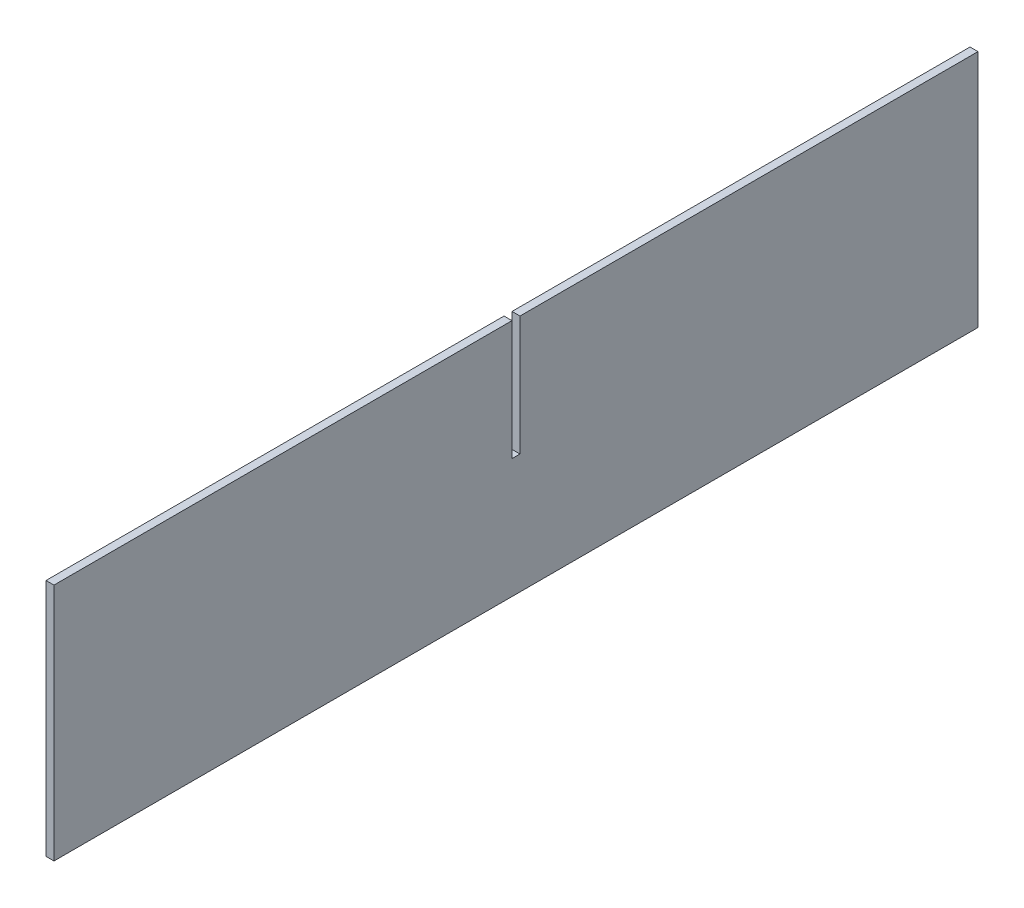
ISO-10303-21;
HEADER;
FILE_DESCRIPTION(('STEP AP214'),'2;1');
FILE_NAME('part.step','',(''),(''),'','','');
FILE_SCHEMA(('AUTOMOTIVE_DESIGN { 1 0 10303 214 1 1 1 1 }'));
ENDSEC;
DATA;
#1=APPLICATION_CONTEXT('core data for automotive mechanical design processes');
#2=APPLICATION_PROTOCOL_DEFINITION('international standard','automotive_design',2000,#1);
#3=PRODUCT_CONTEXT('',#1,'mechanical');
#4=PRODUCT('Part','Part','',(#3));
#5=PRODUCT_RELATED_PRODUCT_CATEGORY('part','',(#4));
#6=PRODUCT_DEFINITION_FORMATION('','',#4);
#7=PRODUCT_DEFINITION_CONTEXT('part definition',#1,'design');
#8=PRODUCT_DEFINITION('design','',#6,#7);
#9=PRODUCT_DEFINITION_SHAPE('','',#8);
#10=(LENGTH_UNIT() NAMED_UNIT(*) SI_UNIT(.MILLI.,.METRE.));
#11=(NAMED_UNIT(*) PLANE_ANGLE_UNIT() SI_UNIT($,.RADIAN.));
#12=(NAMED_UNIT(*) SI_UNIT($,.STERADIAN.) SOLID_ANGLE_UNIT());
#13=UNCERTAINTY_MEASURE_WITH_UNIT(LENGTH_MEASURE(1.E-05),#10,'distance_accuracy_value','');
#14=(GEOMETRIC_REPRESENTATION_CONTEXT(3) GLOBAL_UNCERTAINTY_ASSIGNED_CONTEXT((#13)) GLOBAL_UNIT_ASSIGNED_CONTEXT((#10,
#11,#12)) REPRESENTATION_CONTEXT('',''));
#15=CARTESIAN_POINT('',(0.,0.,0.));
#16=DIRECTION('',(0.,0.,1.));
#17=DIRECTION('',(1.,0.,0.));
#18=AXIS2_PLACEMENT_3D('',#15,#16,#17);
#19=CARTESIAN_POINT('',(1.25,37.5,0.));
#20=DIRECTION('',(0.,1.,0.));
#21=DIRECTION('',(0.,0.,1.));
#22=AXIS2_PLACEMENT_3D('',#19,#20,#21);
#23=PLANE('',#22);
#24=DIRECTION('',(0.,0.,-1.));
#25=VECTOR('',#24,1.);
#26=CARTESIAN_POINT('',(-1.25,37.5,0.));
#27=LINE('',#26,#25);
#28=CARTESIAN_POINT('',(-1.25,37.5,145.));
#29=VERTEX_POINT('',#28);
#30=CARTESIAN_POINT('',(-1.25,37.5,1.25));
#31=VERTEX_POINT('',#30);
#32=EDGE_CURVE('E130',#29,#31,#27,.T.);
#33=ORIENTED_EDGE('',*,*,#32,.F.);
#34=DIRECTION('',(-1.,0.,0.));
#35=VECTOR('',#34,1.);
#36=CARTESIAN_POINT('',(1.25,37.5,145.));
#37=LINE('',#36,#35);
#38=CARTESIAN_POINT('',(1.25,37.5,145.));
#39=VERTEX_POINT('',#38);
#40=EDGE_CURVE('E11',#39,#29,#37,.T.);
#41=ORIENTED_EDGE('',*,*,#40,.F.);
#42=DIRECTION('',(0.,0.,-1.));
#43=VECTOR('',#42,1.);
#44=CARTESIAN_POINT('',(1.25,37.5,0.));
#45=LINE('',#44,#43);
#46=CARTESIAN_POINT('',(1.25,37.5,1.25));
#47=VERTEX_POINT('',#46);
#48=EDGE_CURVE('E149',#39,#47,#45,.T.);
#49=ORIENTED_EDGE('',*,*,#48,.T.);
#50=DIRECTION('',(-1.,0.,0.));
#51=VECTOR('',#50,1.);
#52=CARTESIAN_POINT('',(1.25,37.5,1.25));
#53=LINE('',#52,#51);
#54=EDGE_CURVE('E88',#47,#31,#53,.T.);
#55=ORIENTED_EDGE('',*,*,#54,.T.);
#56=EDGE_LOOP('',(#33,#41,#49,#55));
#57=FACE_BOUND('',#56,.T.);
#58=ADVANCED_FACE('F38',(#57),#23,.T.);
#59=CARTESIAN_POINT('',(1.25,0.,145.));
#60=DIRECTION('',(0.,0.,1.));
#61=DIRECTION('',(1.,0.,0.));
#62=AXIS2_PLACEMENT_3D('',#59,#60,#61);
#63=PLANE('',#62);
#64=DIRECTION('',(0.,1.,0.));
#65=VECTOR('',#64,1.);
#66=CARTESIAN_POINT('',(-1.25,0.,145.));
#67=LINE('',#66,#65);
#68=CARTESIAN_POINT('',(-1.25,-37.5,145.));
#69=VERTEX_POINT('',#68);
#70=EDGE_CURVE('E133',#69,#29,#67,.T.);
#71=ORIENTED_EDGE('',*,*,#70,.F.);
#72=DIRECTION('',(-1.,0.,0.));
#73=VECTOR('',#72,1.);
#74=CARTESIAN_POINT('',(1.25,-37.5,145.));
#75=LINE('',#74,#73);
#76=CARTESIAN_POINT('',(1.25,-37.5,145.));
#77=VERTEX_POINT('',#76);
#78=EDGE_CURVE('E46',#77,#69,#75,.T.);
#79=ORIENTED_EDGE('',*,*,#78,.F.);
#80=DIRECTION('',(0.,1.,0.));
#81=VECTOR('',#80,1.);
#82=CARTESIAN_POINT('',(1.25,0.,145.));
#83=LINE('',#82,#81);
#84=EDGE_CURVE('E171',#77,#39,#83,.T.);
#85=ORIENTED_EDGE('',*,*,#84,.T.);
#86=ORIENTED_EDGE('',*,*,#40,.T.);
#87=EDGE_LOOP('',(#71,#79,#85,#86));
#88=FACE_BOUND('',#87,.T.);
#89=ADVANCED_FACE('F170',(#88),#63,.T.);
#90=CARTESIAN_POINT('',(1.25,-37.5,0.));
#91=DIRECTION('',(0.,1.,0.));
#92=DIRECTION('',(0.,0.,1.));
#93=AXIS2_PLACEMENT_3D('',#90,#91,#92);
#94=PLANE('',#93);
#95=DIRECTION('',(0.,0.,-1.));
#96=VECTOR('',#95,1.);
#97=CARTESIAN_POINT('',(-1.25,-37.5,0.));
#98=LINE('',#97,#96);
#99=CARTESIAN_POINT('',(-1.25,-37.5,-145.));
#100=VERTEX_POINT('',#99);
#101=EDGE_CURVE('E136',#69,#100,#98,.T.);
#102=ORIENTED_EDGE('',*,*,#101,.T.);
#103=DIRECTION('',(-1.,0.,0.));
#104=VECTOR('',#103,1.);
#105=CARTESIAN_POINT('',(1.25,-37.5,-145.));
#106=LINE('',#105,#104);
#107=CARTESIAN_POINT('',(1.25,-37.5,-145.));
#108=VERTEX_POINT('',#107);
#109=EDGE_CURVE('E155',#108,#100,#106,.T.);
#110=ORIENTED_EDGE('',*,*,#109,.F.);
#111=DIRECTION('',(0.,0.,-1.));
#112=VECTOR('',#111,1.);
#113=CARTESIAN_POINT('',(1.25,-37.5,0.));
#114=LINE('',#113,#112);
#115=EDGE_CURVE('E162',#77,#108,#114,.T.);
#116=ORIENTED_EDGE('',*,*,#115,.F.);
#117=ORIENTED_EDGE('',*,*,#78,.T.);
#118=EDGE_LOOP('',(#102,#110,#116,#117));
#119=FACE_BOUND('',#118,.T.);
#120=ADVANCED_FACE('F160',(#119),#94,.F.);
#121=CARTESIAN_POINT('',(1.25,0.,-145.));
#122=DIRECTION('',(0.,0.,1.));
#123=DIRECTION('',(1.,0.,0.));
#124=AXIS2_PLACEMENT_3D('',#121,#122,#123);
#125=PLANE('',#124);
#126=DIRECTION('',(0.,1.,0.));
#127=VECTOR('',#126,1.);
#128=CARTESIAN_POINT('',(-1.25,0.,-145.));
#129=LINE('',#128,#127);
#130=CARTESIAN_POINT('',(-1.25,37.5,-145.));
#131=VERTEX_POINT('',#130);
#132=EDGE_CURVE('E138',#100,#131,#129,.T.);
#133=ORIENTED_EDGE('',*,*,#132,.T.);
#134=DIRECTION('',(-1.,0.,0.));
#135=VECTOR('',#134,1.);
#136=CARTESIAN_POINT('',(1.25,37.5,-145.));
#137=LINE('',#136,#135);
#138=CARTESIAN_POINT('',(1.25,37.5,-145.));
#139=VERTEX_POINT('',#138);
#140=EDGE_CURVE('E153',#139,#131,#137,.T.);
#141=ORIENTED_EDGE('',*,*,#140,.F.);
#142=DIRECTION('',(0.,1.,0.));
#143=VECTOR('',#142,1.);
#144=CARTESIAN_POINT('',(1.25,0.,-145.));
#145=LINE('',#144,#143);
#146=EDGE_CURVE('E177',#108,#139,#145,.T.);
#147=ORIENTED_EDGE('',*,*,#146,.F.);
#148=ORIENTED_EDGE('',*,*,#109,.T.);
#149=EDGE_LOOP('',(#133,#141,#147,#148));
#150=FACE_BOUND('',#149,.T.);
#151=ADVANCED_FACE('F184',(#150),#125,.F.);
#152=CARTESIAN_POINT('',(1.25,37.5,0.));
#153=DIRECTION('',(0.,1.,0.));
#154=DIRECTION('',(0.,0.,1.));
#155=AXIS2_PLACEMENT_3D('',#152,#153,#154);
#156=PLANE('',#155);
#157=DIRECTION('',(0.,0.,-1.));
#158=VECTOR('',#157,1.);
#159=CARTESIAN_POINT('',(-1.25,37.5,0.));
#160=LINE('',#159,#158);
#161=CARTESIAN_POINT('',(-1.25,37.5,-1.24999999999999));
#162=VERTEX_POINT('',#161);
#163=EDGE_CURVE('E141',#162,#131,#160,.T.);
#164=ORIENTED_EDGE('',*,*,#163,.F.);
#165=DIRECTION('',(-1.,0.,0.));
#166=VECTOR('',#165,1.);
#167=CARTESIAN_POINT('',(1.25,37.5,-1.24999999999999));
#168=LINE('',#167,#166);
#169=CARTESIAN_POINT('',(1.25,37.5,-1.24999999999999));
#170=VERTEX_POINT('',#169);
#171=EDGE_CURVE('E117',#170,#162,#168,.T.);
#172=ORIENTED_EDGE('',*,*,#171,.F.);
#173=DIRECTION('',(0.,0.,-1.));
#174=VECTOR('',#173,1.);
#175=CARTESIAN_POINT('',(1.25,37.5,0.));
#176=LINE('',#175,#174);
#177=EDGE_CURVE('E123',#170,#139,#176,.T.);
#178=ORIENTED_EDGE('',*,*,#177,.T.);
#179=ORIENTED_EDGE('',*,*,#140,.T.);
#180=EDGE_LOOP('',(#164,#172,#178,#179));
#181=FACE_BOUND('',#180,.T.);
#182=ADVANCED_FACE('F180',(#181),#156,.T.);
#183=CARTESIAN_POINT('',(1.25,0.,-1.25));
#184=DIRECTION('',(0.,0.,1.));
#185=DIRECTION('',(0.,-1.,0.));
#186=AXIS2_PLACEMENT_3D('',#183,#184,#185);
#187=PLANE('',#186);
#188=DIRECTION('',(0.,1.,0.));
#189=VECTOR('',#188,1.);
#190=CARTESIAN_POINT('',(-1.25,0.,-1.25));
#191=LINE('',#190,#189);
#192=CARTESIAN_POINT('',(-1.25,0.,-1.25));
#193=VERTEX_POINT('',#192);
#194=EDGE_CURVE('E112',#193,#162,#191,.T.);
#195=ORIENTED_EDGE('',*,*,#194,.F.);
#196=DIRECTION('',(-1.,0.,0.));
#197=VECTOR('',#196,1.);
#198=CARTESIAN_POINT('',(1.25,0.,-1.25));
#199=LINE('',#198,#197);
#200=CARTESIAN_POINT('',(1.25,0.,-1.25));
#201=VERTEX_POINT('',#200);
#202=EDGE_CURVE('E107',#201,#193,#199,.T.);
#203=ORIENTED_EDGE('',*,*,#202,.F.);
#204=DIRECTION('',(0.,1.,0.));
#205=VECTOR('',#204,1.);
#206=CARTESIAN_POINT('',(1.25,0.,-1.25));
#207=LINE('',#206,#205);
#208=EDGE_CURVE('E110',#201,#170,#207,.T.);
#209=ORIENTED_EDGE('',*,*,#208,.T.);
#210=ORIENTED_EDGE('',*,*,#171,.T.);
#211=EDGE_LOOP('',(#195,#203,#209,#210));
#212=FACE_BOUND('',#211,.T.);
#213=ADVANCED_FACE('F109',(#212),#187,.T.);
#214=CARTESIAN_POINT('',(1.25,0.,0.));
#215=DIRECTION('',(0.,1.,0.));
#216=DIRECTION('',(0.,0.,1.));
#217=AXIS2_PLACEMENT_3D('',#214,#215,#216);
#218=PLANE('',#217);
#219=DIRECTION('',(0.,0.,-1.));
#220=VECTOR('',#219,1.);
#221=CARTESIAN_POINT('',(-1.25,0.,0.));
#222=LINE('',#221,#220);
#223=CARTESIAN_POINT('',(-1.25,0.,1.25));
#224=VERTEX_POINT('',#223);
#225=EDGE_CURVE('E145',#224,#193,#222,.T.);
#226=ORIENTED_EDGE('',*,*,#225,.F.);
#227=DIRECTION('',(-1.,0.,0.));
#228=VECTOR('',#227,1.);
#229=CARTESIAN_POINT('',(1.25,0.,1.25));
#230=LINE('',#229,#228);
#231=CARTESIAN_POINT('',(1.25,0.,1.25));
#232=VERTEX_POINT('',#231);
#233=EDGE_CURVE('E81',#232,#224,#230,.T.);
#234=ORIENTED_EDGE('',*,*,#233,.F.);
#235=DIRECTION('',(0.,0.,-1.));
#236=VECTOR('',#235,1.);
#237=CARTESIAN_POINT('',(1.25,0.,0.));
#238=LINE('',#237,#236);
#239=EDGE_CURVE('E121',#232,#201,#238,.T.);
#240=ORIENTED_EDGE('',*,*,#239,.T.);
#241=ORIENTED_EDGE('',*,*,#202,.T.);
#242=EDGE_LOOP('',(#226,#234,#240,#241));
#243=FACE_BOUND('',#242,.T.);
#244=ADVANCED_FACE('F125',(#243),#218,.T.);
#245=CARTESIAN_POINT('',(1.25,0.,1.25));
#246=DIRECTION('',(0.,0.,1.));
#247=DIRECTION('',(0.,-1.,0.));
#248=AXIS2_PLACEMENT_3D('',#245,#246,#247);
#249=PLANE('',#248);
#250=DIRECTION('',(0.,1.,0.));
#251=VECTOR('',#250,1.);
#252=CARTESIAN_POINT('',(-1.25,0.,1.25));
#253=LINE('',#252,#251);
#254=EDGE_CURVE('E147',#224,#31,#253,.T.);
#255=ORIENTED_EDGE('',*,*,#254,.T.);
#256=ORIENTED_EDGE('',*,*,#54,.F.);
#257=DIRECTION('',(0.,1.,0.));
#258=VECTOR('',#257,1.);
#259=CARTESIAN_POINT('',(1.25,0.,1.25));
#260=LINE('',#259,#258);
#261=EDGE_CURVE('E54',#232,#47,#260,.T.);
#262=ORIENTED_EDGE('',*,*,#261,.F.);
#263=ORIENTED_EDGE('',*,*,#233,.T.);
#264=EDGE_LOOP('',(#255,#256,#262,#263));
#265=FACE_BOUND('',#264,.T.);
#266=ADVANCED_FACE('F172',(#265),#249,.F.);
#267=CARTESIAN_POINT('',(1.25,0.,0.));
#268=DIRECTION('',(1.,0.,0.));
#269=DIRECTION('',(0.,0.,-1.));
#270=AXIS2_PLACEMENT_3D('',#267,#268,#269);
#271=PLANE('',#270);
#272=ORIENTED_EDGE('',*,*,#48,.F.);
#273=ORIENTED_EDGE('',*,*,#84,.F.);
#274=ORIENTED_EDGE('',*,*,#115,.T.);
#275=ORIENTED_EDGE('',*,*,#146,.T.);
#276=ORIENTED_EDGE('',*,*,#177,.F.);
#277=ORIENTED_EDGE('',*,*,#208,.F.);
#278=ORIENTED_EDGE('',*,*,#239,.F.);
#279=ORIENTED_EDGE('',*,*,#261,.T.);
#280=EDGE_LOOP('',(#272,#273,#274,#275,#276,#277,#278,#279));
#281=FACE_BOUND('',#280,.T.);
#282=ADVANCED_FACE('F120',(#281),#271,.T.);
#283=CARTESIAN_POINT('',(-1.25,0.,0.));
#284=DIRECTION('',(1.,0.,0.));
#285=DIRECTION('',(0.,0.,-1.));
#286=AXIS2_PLACEMENT_3D('',#283,#284,#285);
#287=PLANE('',#286);
#288=ORIENTED_EDGE('',*,*,#32,.T.);
#289=ORIENTED_EDGE('',*,*,#254,.F.);
#290=ORIENTED_EDGE('',*,*,#225,.T.);
#291=ORIENTED_EDGE('',*,*,#194,.T.);
#292=ORIENTED_EDGE('',*,*,#163,.T.);
#293=ORIENTED_EDGE('',*,*,#132,.F.);
#294=ORIENTED_EDGE('',*,*,#101,.F.);
#295=ORIENTED_EDGE('',*,*,#70,.T.);
#296=EDGE_LOOP('',(#288,#289,#290,#291,#292,#293,#294,#295));
#297=FACE_BOUND('',#296,.T.);
#298=ADVANCED_FACE('F169',(#297),#287,.F.);
#299=CLOSED_SHELL('',(#58,#89,#120,#151,#182,#213,#244,#266,#282,#298));
#300=MANIFOLD_SOLID_BREP('B2',#299);
#301=ADVANCED_BREP_SHAPE_REPRESENTATION('',(#18,#300),#14);
#302=SHAPE_DEFINITION_REPRESENTATION(#9,#301);
ENDSEC;
END-ISO-10303-21;
